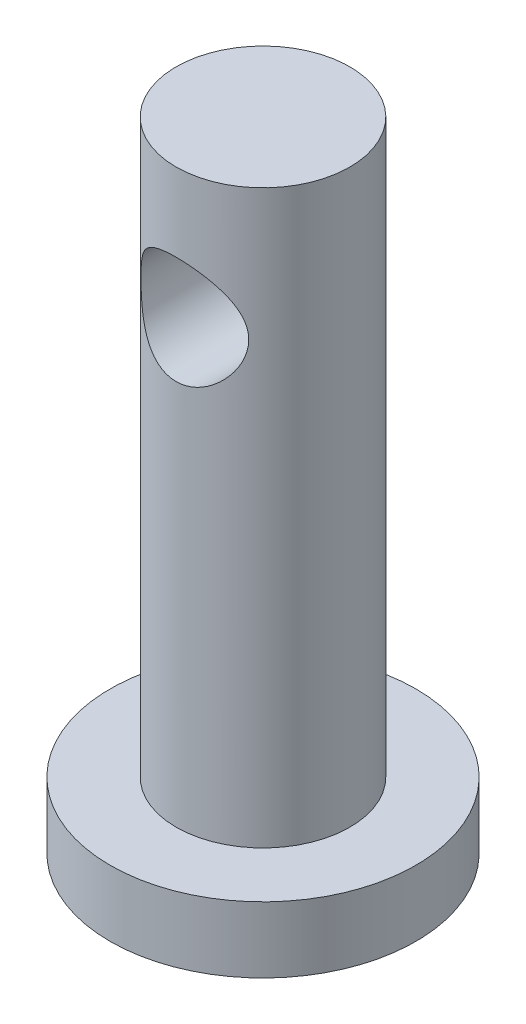
ISO-10303-21;
HEADER;
FILE_DESCRIPTION(('STEP AP214'),'2;1');
FILE_NAME('part.step','',(''),(''),'','','');
FILE_SCHEMA(('AUTOMOTIVE_DESIGN { 1 0 10303 214 1 1 1 1 }'));
ENDSEC;
DATA;
#1=APPLICATION_CONTEXT('core data for automotive mechanical design processes');
#2=APPLICATION_PROTOCOL_DEFINITION('international standard','automotive_design',2000,#1);
#3=PRODUCT_CONTEXT('',#1,'mechanical');
#4=PRODUCT('Part','Part','',(#3));
#5=PRODUCT_RELATED_PRODUCT_CATEGORY('part','',(#4));
#6=PRODUCT_DEFINITION_FORMATION('','',#4);
#7=PRODUCT_DEFINITION_CONTEXT('part definition',#1,'design');
#8=PRODUCT_DEFINITION('design','',#6,#7);
#9=PRODUCT_DEFINITION_SHAPE('','',#8);
#10=(LENGTH_UNIT() NAMED_UNIT(*) SI_UNIT(.MILLI.,.METRE.));
#11=(NAMED_UNIT(*) PLANE_ANGLE_UNIT() SI_UNIT($,.RADIAN.));
#12=(NAMED_UNIT(*) SI_UNIT($,.STERADIAN.) SOLID_ANGLE_UNIT());
#13=UNCERTAINTY_MEASURE_WITH_UNIT(LENGTH_MEASURE(1.E-05),#10,'distance_accuracy_value','');
#14=(GEOMETRIC_REPRESENTATION_CONTEXT(3) GLOBAL_UNCERTAINTY_ASSIGNED_CONTEXT((#13)) GLOBAL_UNIT_ASSIGNED_CONTEXT((#10,
#11,#12)) REPRESENTATION_CONTEXT('',''));
#15=CARTESIAN_POINT('',(0.,0.,0.));
#16=DIRECTION('',(0.,0.,1.));
#17=DIRECTION('',(1.,0.,0.));
#18=AXIS2_PLACEMENT_3D('',#15,#16,#17);
#19=CARTESIAN_POINT('',(0.,26.,0.));
#20=DIRECTION('',(0.,-1.,0.));
#21=DIRECTION('',(0.,0.,-1.));
#22=AXIS2_PLACEMENT_3D('',#19,#20,#21);
#23=CYLINDRICAL_SURFACE('',#22,3.95);
#24=CARTESIAN_POINT('',(0.,22.45,-3.95));
#25=CARTESIAN_POINT('',(-0.12463904222738,22.4499900048076,-3.94999086862867));
#26=CARTESIAN_POINT('',(-0.249441720761348,22.4404231261788,-3.94403784647486));
#27=CARTESIAN_POINT('',(-0.495230875299829,22.4026609079293,-3.92078656396248));
#28=CARTESIAN_POINT('',(-0.616209142620193,22.3744280178287,-3.90346543485799));
#29=CARTESIAN_POINT('',(-0.850304335891044,22.3009691385407,-3.85922343747933));
#30=CARTESIAN_POINT('',(-0.963456964395915,22.2558273176778,-3.83235015067529));
#31=CARTESIAN_POINT('',(-1.18019651817746,22.1503898514803,-3.77125095286919));
#32=CARTESIAN_POINT('',(-1.28378474208385,22.0900962675619,-3.73702604215662));
#33=CARTESIAN_POINT('',(-1.48773938471819,21.9507877234581,-3.66086030114978));
#34=CARTESIAN_POINT('',(-1.58720015366918,21.8706678981152,-3.61852296749627));
#35=CARTESIAN_POINT('',(-1.77215266650576,21.6965086727297,-3.53163428251734));
#36=CARTESIAN_POINT('',(-1.85762547663295,21.6024507290156,-3.48708003501818));
#37=CARTESIAN_POINT('',(-2.02373495802823,21.3884236912715,-3.39370316486541));
#38=CARTESIAN_POINT('',(-2.10221748214444,21.2666722372896,-3.34510069673928));
#39=CARTESIAN_POINT('',(-2.23736264222211,21.0088594810501,-3.25626615047279));
#40=CARTESIAN_POINT('',(-2.29406189794597,20.8728226885239,-3.21602007725346));
#41=CARTESIAN_POINT('',(-2.37133040386005,20.6256958535671,-3.15926847601044));
#42=CARTESIAN_POINT('',(-2.39743241899507,20.5171305107291,-3.13932323279219));
#43=CARTESIAN_POINT('',(-2.43461681838,20.2960731937424,-3.1105807754496));
#44=CARTESIAN_POINT('',(-2.44571991355581,20.1835868545814,-3.10176819013503));
#45=CARTESIAN_POINT('',(-2.45224612320702,19.9575824536448,-3.09661294769957));
#46=CARTESIAN_POINT('',(-2.447630259437,19.8440625243225,-3.10030128897376));
#47=CARTESIAN_POINT('',(-2.42294230767287,19.6197258587346,-3.11962819958505));
#48=CARTESIAN_POINT('',(-2.40285796356701,19.5089113379039,-3.13527624485667));
#49=CARTESIAN_POINT('',(-2.34894129092244,19.2950918260923,-3.17585718920292));
#50=CARTESIAN_POINT('',(-2.31540371322856,19.1919723169873,-3.20059012284793));
#51=CARTESIAN_POINT('',(-2.23588373384974,18.9925986470051,-3.25663703691618));
#52=CARTESIAN_POINT('',(-2.18989690412387,18.8963469443412,-3.2879533580795));
#53=CARTESIAN_POINT('',(-2.07702294266976,18.6945498721182,-3.36061942884397));
#54=CARTESIAN_POINT('',(-2.00784465903829,18.5905692558489,-3.402754155936));
#55=CARTESIAN_POINT('',(-1.85486989162001,18.3945615387075,-3.48850380900918));
#56=CARTESIAN_POINT('',(-1.77105855595072,18.3025467497719,-3.53212020223624));
#57=CARTESIAN_POINT('',(-1.5753826002162,18.1181056836182,-3.62410699576752));
#58=CARTESIAN_POINT('',(-1.46117517901376,18.0279655502258,-3.67212259741522));
#59=CARTESIAN_POINT('',(-1.21630380926471,17.8682427474988,-3.76031350028282));
#60=CARTESIAN_POINT('',(-1.08564688271259,17.7986513484403,-3.80049212841669));
#61=CARTESIAN_POINT('',(-0.883771958828503,17.7138667719974,-3.85044628498563));
#62=CARTESIAN_POINT('',(-0.81754521185607,17.6893401500059,-3.86508114788293));
#63=CARTESIAN_POINT('',(-0.682664774084141,17.6459658612445,-3.89116601250221));
#64=CARTESIAN_POINT('',(-0.61401250240342,17.6271149332793,-3.90261784287003));
#65=CARTESIAN_POINT('',(-0.474904681455086,17.5954109034463,-3.92197539881948));
#66=CARTESIAN_POINT('',(-0.404450745307657,17.5825526216122,-3.92988418673143));
#67=CARTESIAN_POINT('',(-0.262397076122861,17.5630355725812,-3.94192081462367));
#68=CARTESIAN_POINT('',(-0.190797533782906,17.5563757842834,-3.94604927734917));
#69=CARTESIAN_POINT('',(0.00362708881578125,17.5469410384296,-3.95189247545934));
#70=CARTESIAN_POINT('',(0.126936226390087,17.5502264863188,-3.94984643870674));
#71=CARTESIAN_POINT('',(0.370876823732719,17.5751266378465,-3.93445328692922));
#72=CARTESIAN_POINT('',(0.491508437449216,17.5967402848621,-3.92110682337525));
#73=CARTESIAN_POINT('',(0.722489688490799,17.6560260681214,-3.88505908897496));
#74=CARTESIAN_POINT('',(0.833053325804267,17.6930900007419,-3.86271311027456));
#75=CARTESIAN_POINT('',(1.04629039398706,17.781640152218,-3.81049138262789));
#76=CARTESIAN_POINT('',(1.14896246054724,17.8331288577399,-3.7806143355005));
#77=CARTESIAN_POINT('',(1.35483343501639,17.9548477761652,-3.7121232049923));
#78=CARTESIAN_POINT('',(1.4570245635516,18.02645122807,-3.67292965412859));
#79=CARTESIAN_POINT('',(1.64867087554157,18.1834754362298,-3.59099875220859));
#80=CARTESIAN_POINT('',(1.73811150497126,18.2689117482217,-3.54825743819936));
#81=CARTESIAN_POINT('',(1.91491776021567,18.4652516294568,-3.45642303136016));
#82=CARTESIAN_POINT('',(2.00017141417144,18.5780493949942,-3.40729274278744));
#83=CARTESIAN_POINT('',(2.1507855288034,18.8181924540513,-3.31428121322166));
#84=CARTESIAN_POINT('',(2.21616127470322,18.9455264656791,-3.27039595487614));
#85=CARTESIAN_POINT('',(2.3130493807509,19.1843972470397,-3.20234980480435));
#86=CARTESIAN_POINT('',(2.34879982535915,19.2935768492777,-3.17598022447927));
#87=CARTESIAN_POINT('',(2.40483273310108,19.5177358016076,-3.1337723409393));
#88=CARTESIAN_POINT('',(2.42513893244259,19.6327059610368,-3.1179178818902));
#89=CARTESIAN_POINT('',(2.44916018569265,19.8660871672006,-3.09909171549059));
#90=CARTESIAN_POINT('',(2.45278704713555,19.9845131799633,-3.09618849056753));
#91=CARTESIAN_POINT('',(2.44293385119175,20.2202229703671,-3.10396609455788));
#92=CARTESIAN_POINT('',(2.42944719952692,20.3375062901476,-3.11465215977883));
#93=CARTESIAN_POINT('',(2.38790552036247,20.558698504437,-3.14658745423181));
#94=CARTESIAN_POINT('',(2.3610021486049,20.6629549247283,-3.16699668084229));
#95=CARTESIAN_POINT('',(2.29453446053315,20.8654360236199,-3.21547767458665));
#96=CARTESIAN_POINT('',(2.25496502321755,20.9636582433619,-3.24355254032962));
#97=CARTESIAN_POINT('',(2.15764707907758,21.1668568518849,-3.30922672370469));
#98=CARTESIAN_POINT('',(2.09808071858814,21.270701635714,-3.34761957964425));
#99=CARTESIAN_POINT('',(1.96514941819452,21.4679405236978,-3.42734616697594));
#100=CARTESIAN_POINT('',(1.89177318724724,21.5613259758647,-3.46868228748609));
#101=CARTESIAN_POINT('',(1.71692760582376,21.7534585772628,-3.55894704024339));
#102=CARTESIAN_POINT('',(1.61276929562162,21.849805530676,-3.60781312492092));
#103=CARTESIAN_POINT('',(1.38768136286565,22.0241195836477,-3.7002164177616));
#104=CARTESIAN_POINT('',(1.26674233571364,22.1020763099557,-3.74375061177687));
#105=CARTESIAN_POINT('',(1.07503753880387,22.2027234666814,-3.80148036817886));
#106=CARTESIAN_POINT('',(1.00954903263324,22.2335163276326,-3.81943572960363));
#107=CARTESIAN_POINT('',(0.875476889580751,22.2893895173588,-3.85237483158898));
#108=CARTESIAN_POINT('',(0.806895071766008,22.3144731523752,-3.86736029138113));
#109=CARTESIAN_POINT('',(0.667350846014083,22.3584915388264,-3.89386377438172));
#110=CARTESIAN_POINT('',(0.596395569777687,22.3774431546823,-3.90539130119194));
#111=CARTESIAN_POINT('',(0.452615443865854,22.4089517205017,-3.92465185976706));
#112=CARTESIAN_POINT('',(0.379792052015011,22.4215135064743,-3.93238776098228));
#113=CARTESIAN_POINT('',(0.255702908507683,22.4371558552174,-3.94204314998478));
#114=CARTESIAN_POINT('',(0.204730719791246,22.4419668229421,-3.94502134959156));
#115=CARTESIAN_POINT('',(0.102514928237231,22.448391048675,-3.94900171300643));
#116=CARTESIAN_POINT('',(0.0512713090331222,22.4500041116057,-3.95000375626572));
#117=CARTESIAN_POINT('',(0.,22.45,-3.95));
#118=B_SPLINE_CURVE_WITH_KNOTS('',3,(#24,#25,#26,#27,#28,#29,#30,#31,#32,#33,#34,#35,#36,#37,
#38,#39,#40,#41,#42,#43,#44,#45,#46,#47,#48,#49,#50,#51,#52,#53,#54,#55,#56,#57,#58,#59,#60,#61,
#62,#63,#64,#65,#66,#67,#68,#69,#70,#71,#72,#73,#74,#75,#76,#77,#78,#79,#80,#81,#82,#83,#84,#85,
#86,#87,#88,#89,#90,#91,#92,#93,#94,#95,#96,#97,#98,#99,#100,#101,#102,#103,#104,#105,#106,#107,
#108,#109,#110,#111,#112,#113,#114,#115,#116,#117),.UNSPECIFIED.,.T.,.F.,(4,2,2,2,2,2,2,2,2,2,2,
2,2,2,2,2,2,2,2,2,2,2,2,2,2,2,2,2,2,2,2,2,2,2,2,2,2,2,2,2,2,2,2,2,2,2,4),(0.,0.373710833075165,
0.748175758423929,1.12080094289725,1.49337545867105,1.89547137129338,2.29810712828128,
2.75427901358835,3.20968063917653,3.5485426501749,3.88693627115371,4.22616961595065,
4.56567202172719,4.89811036852902,5.23066711514506,5.62461864647172,6.01897237004842,
6.4763738175574,6.93358066659084,7.14967401839036,7.36564296717661,7.58142488734634,
7.79717125466246,8.16520592714505,8.53321938382929,8.88794076564699,9.24272333504982,
9.63357741283926,10.0248741178432,10.4719317397959,10.9186447199144,11.2708503634746,
11.6225136034156,11.9760341507706,12.3296909600877,12.6571826520913,12.9848069194567,
13.3606213215464,13.7367443374697,14.1849234325316,14.6333547276712,14.8567546006068,
15.0800247705147,15.3026755726785,15.5251576145905,15.6788773042296,15.832606370734),.UNSPECIFIED.);
#119=CARTESIAN_POINT('',(0.,22.45,-3.95));
#120=VERTEX_POINT('',#119);
#121=EDGE_CURVE('E10',#120,#120,#118,.T.);
#122=ORIENTED_EDGE('',*,*,#121,.T.);
#123=EDGE_LOOP('',(#122));
#124=FACE_BOUND('',#123,.T.);
#125=CARTESIAN_POINT('',(2.45,20.,3.09838667696593));
#126=CARTESIAN_POINT('',(2.4499993772144,19.9389663567111,3.09838763155436));
#127=CARTESIAN_POINT('',(2.44771324440492,19.8779177848681,3.10019981151983));
#128=CARTESIAN_POINT('',(2.43861905034398,19.7563545605192,3.10735660821109));
#129=CARTESIAN_POINT('',(2.43180819492403,19.6958402613572,3.11270340767334));
#130=CARTESIAN_POINT('',(2.40470772666059,19.5156327017804,3.13375792731548));
#131=CARTESIAN_POINT('',(2.37775066183726,19.3974471807764,3.15447880263077));
#132=CARTESIAN_POINT('',(2.30800783071794,19.1694905859014,3.20584101744627));
#133=CARTESIAN_POINT('',(2.2653574354214,19.0596569694541,3.23639724270563));
#134=CARTESIAN_POINT('',(2.16583944448298,18.8488138742764,3.30382402354558));
#135=CARTESIAN_POINT('',(2.10897185572524,18.7478043912733,3.34069457606869));
#136=CARTESIAN_POINT('',(1.9738848983081,18.5428577732234,3.42246828640732));
#137=CARTESIAN_POINT('',(1.89383877036431,18.440291131067,3.46778953343375));
#138=CARTESIAN_POINT('',(1.71842846877018,18.2488894176962,3.55798625767303));
#139=CARTESIAN_POINT('',(1.62305122245473,18.1600661933317,3.60286131944088));
#140=CARTESIAN_POINT('',(1.40590897278677,17.9882297283526,3.6934087025634));
#141=CARTESIAN_POINT('',(1.28235768603131,17.9071427273057,3.73854883810293));
#142=CARTESIAN_POINT('',(1.08581979657301,17.8024957275281,3.79845005638579));
#143=CARTESIAN_POINT('',(1.01841745241003,17.7704371312316,3.81711992177599));
#144=CARTESIAN_POINT('',(0.880301095267916,17.712388099918,3.85131328836084));
#145=CARTESIAN_POINT('',(0.809589390441145,17.6863935090385,3.86683894341818));
#146=CARTESIAN_POINT('',(0.67263979421227,17.6431618486437,3.89286785194127));
#147=CARTESIAN_POINT('',(0.606661459979827,17.6253090386305,3.90371805360176));
#148=CARTESIAN_POINT('',(0.473039218037441,17.5951254530065,3.92215227813525));
#149=CARTESIAN_POINT('',(0.405396289079823,17.5827915105501,3.92973817404153));
#150=CARTESIAN_POINT('',(0.269050424858101,17.5638465991489,3.94141940573522));
#151=CARTESIAN_POINT('',(0.200348153005384,17.5572321855758,3.94551684244982));
#152=CARTESIAN_POINT('',(0.0625345003016436,17.549824660375,3.95010806683297));
#153=CARTESIAN_POINT('',(-0.00657683367167161,17.5490308941617,3.95060225971961));
#154=CARTESIAN_POINT('',(-0.195241927478468,17.5548687581908,3.94697840108901));
#155=CARTESIAN_POINT('',(-0.314612607553639,17.5673738396063,3.93921146914864));
#156=CARTESIAN_POINT('',(-0.549093667772815,17.6093480763997,3.91343212885105));
#157=CARTESIAN_POINT('',(-0.664203725149126,17.638818514217,3.89541894596399));
#158=CARTESIAN_POINT('',(-0.887789110390331,17.713459636337,3.8506328473901));
#159=CARTESIAN_POINT('',(-0.996241854608734,17.7586806251947,3.82383188130129));
#160=CARTESIAN_POINT('',(-1.20410853001856,17.8631395939245,3.76355621976545));
#161=CARTESIAN_POINT('',(-1.30352034153624,17.9223808492225,3.73007996512036));
#162=CARTESIAN_POINT('',(-1.50366635103436,18.0614138916342,3.654353402372));
#163=CARTESIAN_POINT('',(-1.60304661379257,18.1428403605831,3.61153006526591));
#164=CARTESIAN_POINT('',(-1.78759839543799,18.3197133160361,3.52384143984421));
#165=CARTESIAN_POINT('',(-1.87274912036959,18.4151799435654,3.47897328307303));
#166=CARTESIAN_POINT('',(-2.03747335530229,18.6317825803657,3.3854483746428));
#167=CARTESIAN_POINT('',(-2.11494395816499,18.7546398669386,3.33704009250698));
#168=CARTESIAN_POINT('',(-2.24781484983932,19.0145898869076,3.24903123008387));
#169=CARTESIAN_POINT('',(-2.30325590811351,19.1516557263094,3.20941444021411));
#170=CARTESIAN_POINT('',(-2.37789119637361,19.3997718841219,3.15431455726887));
#171=CARTESIAN_POINT('',(-2.40276326873824,19.5083115221464,3.13523409240234));
#172=CARTESIAN_POINT('',(-2.43752766287642,19.7290720674648,3.10828924339322));
#173=CARTESIAN_POINT('',(-2.44743984885114,19.8412878906332,3.10040998674807));
#174=CARTESIAN_POINT('',(-2.45169133141207,20.0664422051229,3.09705027476155));
#175=CARTESIAN_POINT('',(-2.44599788556266,20.1793817191055,3.10159588819119));
#176=CARTESIAN_POINT('',(-2.41934579907297,20.402366389997,3.12242458114727));
#177=CARTESIAN_POINT('',(-2.39837459762798,20.5124090880691,3.13871731861029));
#178=CARTESIAN_POINT('',(-2.34269992558813,20.7254172658248,3.18047670560911));
#179=CARTESIAN_POINT('',(-2.30818356333141,20.8284576273217,3.20581794942855));
#180=CARTESIAN_POINT('',(-2.22670798577665,21.0275484741798,3.26293453127013));
#181=CARTESIAN_POINT('',(-2.17974431179076,21.1235964390844,3.29471217387804));
#182=CARTESIAN_POINT('',(-2.06451535781951,21.3252118044827,3.36834981925927));
#183=CARTESIAN_POINT('',(-1.99390284058965,21.4291562817951,3.4109808925));
#184=CARTESIAN_POINT('',(-1.83793787200911,21.6248569432314,3.49749193408889));
#185=CARTESIAN_POINT('',(-1.7525703069421,21.7166004576174,3.54137314408857));
#186=CARTESIAN_POINT('',(-1.55393508171789,21.8996679746588,3.63339290561623));
#187=CARTESIAN_POINT('',(-1.43839495753507,21.9887438538653,3.68114390451232));
#188=CARTESIAN_POINT('',(-1.1909558795661,22.1460492802617,3.7684543578266));
#189=CARTESIAN_POINT('',(-1.05906535432606,22.2142895058109,3.80801800493513));
#190=CARTESIAN_POINT('',(-0.85600277689831,22.2966671319152,3.85671421190296));
#191=CARTESIAN_POINT('',(-0.78974857681595,22.3202986712565,3.87085445010018));
#192=CARTESIAN_POINT('',(-0.654911769886215,22.3618970202565,3.89593101739014));
#193=CARTESIAN_POINT('',(-0.586330528386669,22.3798670901259,3.90686919016455));
#194=CARTESIAN_POINT('',(-0.447466153060363,22.4098369126497,3.92519723254989));
#195=CARTESIAN_POINT('',(-0.377184490405333,22.4218416454297,3.93259006178876));
#196=CARTESIAN_POINT('',(-0.235577681359206,22.4396933506698,3.94360968919237));
#197=CARTESIAN_POINT('',(-0.164252701983913,22.4455412980133,3.94723708358584));
#198=CARTESIAN_POINT('',(0.0294484043597924,22.4528622451146,3.95177151276154));
#199=CARTESIAN_POINT('',(0.152215565294971,22.4483062811779,3.94893416670352));
#200=CARTESIAN_POINT('',(0.394845844462411,22.4210595720242,3.93210154012611));
#201=CARTESIAN_POINT('',(0.514709057426408,22.3983694191983,3.91810662409205));
#202=CARTESIAN_POINT('',(0.744653460330881,22.3370312648151,3.88086887454374));
#203=CARTESIAN_POINT('',(0.854922486632603,22.2988981604705,3.85792524275016));
#204=CARTESIAN_POINT('',(1.06741865675227,22.2082744049461,3.80462032223802));
#205=CARTESIAN_POINT('',(1.1696443749072,22.1557812158137,3.7742577224177));
#206=CARTESIAN_POINT('',(1.37477984573035,22.0318253934573,3.70478108186305));
#207=CARTESIAN_POINT('',(1.47663512170645,21.9589499883674,3.66508297191948));
#208=CARTESIAN_POINT('',(1.6674204469949,21.7993627488122,3.58232447014298));
#209=CARTESIAN_POINT('',(1.75633552362935,21.7126351258757,3.53926027065857));
#210=CARTESIAN_POINT('',(1.93169026068118,21.5136281931402,3.44705720169205));
#211=CARTESIAN_POINT('',(2.01600945767793,21.3994701816433,3.39791878066766));
#212=CARTESIAN_POINT('',(2.16449560942021,21.1565770474814,3.30531755480361));
#213=CARTESIAN_POINT('',(2.22867497529703,21.0278509691782,3.2618512642113));
#214=CARTESIAN_POINT('',(2.32258520894183,20.7879278987836,3.19541038896542));
#215=CARTESIAN_POINT('',(2.35679578127187,20.6791516892423,3.17002982913593));
#216=CARTESIAN_POINT('',(2.40985804921596,20.4561948583335,3.12989168201696));
#217=CARTESIAN_POINT('',(2.42875910908174,20.3420328732568,3.1150999699396));
#218=CARTESIAN_POINT('',(2.44298117210337,20.1891651896417,3.10392527763918));
#219=CARTESIAN_POINT('',(2.44560985463538,20.1514207116574,3.10185351034546));
#220=CARTESIAN_POINT('',(2.44911966451159,20.0757860953532,3.09908375440188));
#221=CARTESIAN_POINT('',(2.45000038668897,20.0378959253016,3.09838608425985));
#222=CARTESIAN_POINT('',(2.45,20.,3.09838667696593));
#223=B_SPLINE_CURVE_WITH_KNOTS('',3,(#125,#126,#127,#128,#129,#130,#131,#132,#133,#134,#135,
#136,#137,#138,#139,#140,#141,#142,#143,#144,#145,#146,#147,#148,#149,#150,#151,#152,#153,#154,
#155,#156,#157,#158,#159,#160,#161,#162,#163,#164,#165,#166,#167,#168,#169,#170,#171,#172,#173,
#174,#175,#176,#177,#178,#179,#180,#181,#182,#183,#184,#185,#186,#187,#188,#189,#190,#191,#192,
#193,#194,#195,#196,#197,#198,#199,#200,#201,#202,#203,#204,#205,#206,#207,#208,#209,#210,#211,
#212,#213,#214,#215,#216,#217,#218,#219,#220,#221,#222),.UNSPECIFIED.,.T.,.F.,(4,2,2,2,2,2,2,2,
2,2,2,2,2,2,2,2,2,2,2,2,2,2,2,2,2,2,2,2,2,2,2,2,2,2,2,2,2,2,2,2,2,2,2,2,2,2,2,2,4),(0.,
0.183052043791169,0.366217233586985,0.733056788348142,1.09680344984739,1.4605499352169,
1.87226425362231,2.28433151669087,2.74508251365453,2.97559204318102,3.20594312977712,
3.4132633618825,3.62046447610933,3.82754071485762,4.03459366560926,4.39351655674936,
4.75246658302819,5.11257370869593,5.47276504606835,5.87745545493817,6.28273217162864,
6.73979414955405,7.19600627136847,7.53351191980695,7.87056902227216,8.20833385086435,
8.54637669103372,8.87990559482085,9.21355413213652,9.6101520928294,10.0071587259751,
10.465411297504,10.923428616931,11.1384040562237,11.3532554726396,11.5679272190327,
11.7825649685571,12.1491685398545,12.5157601357711,12.8710212026879,13.2263450978469,
13.6189653786622,14.0120363959806,14.4605833244947,14.9088532915429,15.2579691090618,
15.6059546995639,15.7195857860604,15.8332432084916),.UNSPECIFIED.);
#224=CARTESIAN_POINT('',(2.45,20.,3.09838667696593));
#225=VERTEX_POINT('',#224);
#226=EDGE_CURVE('E55',#225,#225,#223,.T.);
#227=ORIENTED_EDGE('',*,*,#226,.T.);
#228=EDGE_LOOP('',(#227));
#229=FACE_BOUND('',#228,.T.);
#230=CARTESIAN_POINT('',(0.,26.,0.));
#231=DIRECTION('',(0.,1.,0.));
#232=DIRECTION('',(0.,0.,1.));
#233=AXIS2_PLACEMENT_3D('',#230,#231,#232);
#234=CIRCLE('',#233,3.95);
#235=CARTESIAN_POINT('',(0.,26.,3.95));
#236=VERTEX_POINT('',#235);
#237=EDGE_CURVE('E60',#236,#236,#234,.T.);
#238=ORIENTED_EDGE('',*,*,#237,.F.);
#239=EDGE_LOOP('',(#238));
#240=FACE_BOUND('',#239,.T.);
#241=CARTESIAN_POINT('',(0.,0.,0.));
#242=DIRECTION('',(0.,1.,0.));
#243=DIRECTION('',(0.,0.,1.));
#244=AXIS2_PLACEMENT_3D('',#241,#242,#243);
#245=CIRCLE('',#244,3.95);
#246=CARTESIAN_POINT('',(0.,0.,3.95));
#247=VERTEX_POINT('',#246);
#248=EDGE_CURVE('E65',#247,#247,#245,.T.);
#249=ORIENTED_EDGE('',*,*,#248,.T.);
#250=EDGE_LOOP('',(#249));
#251=FACE_BOUND('',#250,.T.);
#252=ADVANCED_FACE('F43',(#124,#229,#240,#251),#23,.T.);
#253=CARTESIAN_POINT('',(0.,26.,0.));
#254=DIRECTION('',(0.,1.,0.));
#255=DIRECTION('',(0.,0.,1.));
#256=AXIS2_PLACEMENT_3D('',#253,#254,#255);
#257=PLANE('',#256);
#258=ORIENTED_EDGE('',*,*,#237,.T.);
#259=EDGE_LOOP('',(#258));
#260=FACE_BOUND('',#259,.T.);
#261=ADVANCED_FACE('F76',(#260),#257,.T.);
#262=CARTESIAN_POINT('',(0.,20.,-3.95));
#263=DIRECTION('',(0.,0.,1.));
#264=DIRECTION('',(1.,0.,0.));
#265=AXIS2_PLACEMENT_3D('',#262,#263,#264);
#266=CYLINDRICAL_SURFACE('',#265,2.45);
#267=ORIENTED_EDGE('',*,*,#226,.F.);
#268=EDGE_LOOP('',(#267));
#269=FACE_BOUND('',#268,.T.);
#270=ORIENTED_EDGE('',*,*,#121,.F.);
#271=EDGE_LOOP('',(#270));
#272=FACE_BOUND('',#271,.T.);
#273=ADVANCED_FACE('F71',(#269,#272),#266,.F.);
#274=CARTESIAN_POINT('',(0.,-3.,0.));
#275=DIRECTION('',(0.,1.,0.));
#276=DIRECTION('',(0.,0.,1.));
#277=AXIS2_PLACEMENT_3D('',#274,#275,#276);
#278=CYLINDRICAL_SURFACE('',#277,6.95);
#279=CARTESIAN_POINT('',(0.,-3.,0.));
#280=DIRECTION('',(0.,-1.,0.));
#281=DIRECTION('',(0.,0.,-1.));
#282=AXIS2_PLACEMENT_3D('',#279,#280,#281);
#283=CIRCLE('',#282,6.95);
#284=CARTESIAN_POINT('',(0.,-3.,-6.95));
#285=VERTEX_POINT('',#284);
#286=EDGE_CURVE('E92',#285,#285,#283,.T.);
#287=ORIENTED_EDGE('',*,*,#286,.F.);
#288=EDGE_LOOP('',(#287));
#289=FACE_BOUND('',#288,.T.);
#290=CARTESIAN_POINT('',(0.,0.,0.));
#291=DIRECTION('',(0.,-1.,0.));
#292=DIRECTION('',(0.,0.,-1.));
#293=AXIS2_PLACEMENT_3D('',#290,#291,#292);
#294=CIRCLE('',#293,6.95);
#295=CARTESIAN_POINT('',(0.,0.,-6.95));
#296=VERTEX_POINT('',#295);
#297=EDGE_CURVE('E95',#296,#296,#294,.T.);
#298=ORIENTED_EDGE('',*,*,#297,.T.);
#299=EDGE_LOOP('',(#298));
#300=FACE_BOUND('',#299,.T.);
#301=ADVANCED_FACE('F75',(#289,#300),#278,.T.);
#302=CARTESIAN_POINT('',(0.,-3.,0.));
#303=DIRECTION('',(0.,-1.,0.));
#304=DIRECTION('',(0.,0.,-1.));
#305=AXIS2_PLACEMENT_3D('',#302,#303,#304);
#306=PLANE('',#305);
#307=ORIENTED_EDGE('',*,*,#286,.T.);
#308=EDGE_LOOP('',(#307));
#309=FACE_BOUND('',#308,.T.);
#310=ADVANCED_FACE('F107',(#309),#306,.T.);
#311=CARTESIAN_POINT('',(0.,0.,0.));
#312=DIRECTION('',(0.,-1.,0.));
#313=DIRECTION('',(0.,0.,-1.));
#314=AXIS2_PLACEMENT_3D('',#311,#312,#313);
#315=PLANE('',#314);
#316=ORIENTED_EDGE('',*,*,#248,.F.);
#317=EDGE_LOOP('',(#316));
#318=FACE_BOUND('',#317,.T.);
#319=ORIENTED_EDGE('',*,*,#297,.F.);
#320=EDGE_LOOP('',(#319));
#321=FACE_BOUND('',#320,.T.);
#322=ADVANCED_FACE('F105',(#318,#321),#315,.F.);
#323=CLOSED_SHELL('',(#252,#261,#273,#301,#310,#322));
#324=MANIFOLD_SOLID_BREP('B2',#323);
#325=ADVANCED_BREP_SHAPE_REPRESENTATION('',(#18,#324),#14);
#326=SHAPE_DEFINITION_REPRESENTATION(#9,#325);
ENDSEC;
END-ISO-10303-21;
